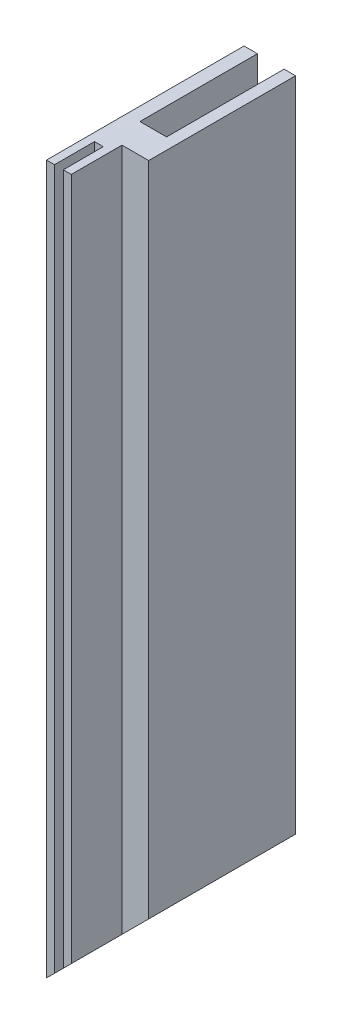
ISO-10303-21;
HEADER;
FILE_DESCRIPTION(('STEP AP214'),'2;1');
FILE_NAME('part.step','',(''),(''),'','','');
FILE_SCHEMA(('AUTOMOTIVE_DESIGN { 1 0 10303 214 1 1 1 1 }'));
ENDSEC;
DATA;
#1=APPLICATION_CONTEXT('core data for automotive mechanical design processes');
#2=APPLICATION_PROTOCOL_DEFINITION('international standard','automotive_design',2000,#1);
#3=PRODUCT_CONTEXT('',#1,'mechanical');
#4=PRODUCT('Part','Part','',(#3));
#5=PRODUCT_RELATED_PRODUCT_CATEGORY('part','',(#4));
#6=PRODUCT_DEFINITION_FORMATION('','',#4);
#7=PRODUCT_DEFINITION_CONTEXT('part definition',#1,'design');
#8=PRODUCT_DEFINITION('design','',#6,#7);
#9=PRODUCT_DEFINITION_SHAPE('','',#8);
#10=(LENGTH_UNIT() NAMED_UNIT(*) SI_UNIT(.MILLI.,.METRE.));
#11=(NAMED_UNIT(*) PLANE_ANGLE_UNIT() SI_UNIT($,.RADIAN.));
#12=(NAMED_UNIT(*) SI_UNIT($,.STERADIAN.) SOLID_ANGLE_UNIT());
#13=UNCERTAINTY_MEASURE_WITH_UNIT(LENGTH_MEASURE(1.E-05),#10,'distance_accuracy_value','');
#14=(GEOMETRIC_REPRESENTATION_CONTEXT(3) GLOBAL_UNCERTAINTY_ASSIGNED_CONTEXT((#13)) GLOBAL_UNIT_ASSIGNED_CONTEXT((#10,
#11,#12)) REPRESENTATION_CONTEXT('',''));
#15=CARTESIAN_POINT('',(0.,0.,0.));
#16=DIRECTION('',(0.,0.,1.));
#17=DIRECTION('',(1.,0.,0.));
#18=AXIS2_PLACEMENT_3D('',#15,#16,#17);
#19=CARTESIAN_POINT('',(-51.5057953741814,265.3,37.));
#20=DIRECTION('',(1.,0.,0.));
#21=DIRECTION('',(0.,0.,-1.));
#22=AXIS2_PLACEMENT_3D('',#19,#20,#21);
#23=PLANE('',#22);
#24=DIRECTION('',(0.,0.,1.));
#25=VECTOR('',#24,1.);
#26=CARTESIAN_POINT('',(-51.5057953741814,0.,37.));
#27=LINE('',#26,#25);
#28=CARTESIAN_POINT('',(-51.5057953741814,0.,-37.));
#29=VERTEX_POINT('',#28);
#30=CARTESIAN_POINT('',(-51.5057953741814,0.,37.));
#31=VERTEX_POINT('',#30);
#32=EDGE_CURVE('E275',#29,#31,#27,.T.);
#33=ORIENTED_EDGE('',*,*,#32,.T.);
#34=DIRECTION('',(0.,-1.,0.));
#35=VECTOR('',#34,1.);
#36=CARTESIAN_POINT('',(-51.5057953741814,265.3,37.));
#37=LINE('',#36,#35);
#38=CARTESIAN_POINT('',(-51.5057953741814,265.3,37.));
#39=VERTEX_POINT('',#38);
#40=EDGE_CURVE('E11',#39,#31,#37,.T.);
#41=ORIENTED_EDGE('',*,*,#40,.F.);
#42=DIRECTION('',(0.,0.,1.));
#43=VECTOR('',#42,1.);
#44=CARTESIAN_POINT('',(-51.5057953741814,265.3,37.));
#45=LINE('',#44,#43);
#46=CARTESIAN_POINT('',(-51.5057953741814,265.3,-37.));
#47=VERTEX_POINT('',#46);
#48=EDGE_CURVE('E285',#47,#39,#45,.T.);
#49=ORIENTED_EDGE('',*,*,#48,.F.);
#50=DIRECTION('',(0.,-1.,0.));
#51=VECTOR('',#50,1.);
#52=CARTESIAN_POINT('',(-51.5057953741814,265.3,-37.));
#53=LINE('',#52,#51);
#54=EDGE_CURVE('E318',#47,#29,#53,.T.);
#55=ORIENTED_EDGE('',*,*,#54,.T.);
#56=EDGE_LOOP('',(#33,#41,#49,#55));
#57=FACE_BOUND('',#56,.T.);
#58=ADVANCED_FACE('F42',(#57),#23,.F.);
#59=CARTESIAN_POINT('',(-48.5057953741814,265.3,37.));
#60=DIRECTION('',(0.,0.,-1.));
#61=DIRECTION('',(-1.,0.,0.));
#62=AXIS2_PLACEMENT_3D('',#59,#60,#61);
#63=PLANE('',#62);
#64=ORIENTED_EDGE('',*,*,#40,.T.);
#65=DIRECTION('',(0.707106781186546,0.707106781186549,0.));
#66=VECTOR('',#65,1.);
#67=CARTESIAN_POINT('',(82.6442046258186,134.15,37.));
#68=LINE('',#67,#66);
#69=CARTESIAN_POINT('',(-48.5057953741814,3.,37.));
#70=VERTEX_POINT('',#69);
#71=EDGE_CURVE('E242',#31,#70,#68,.T.);
#72=ORIENTED_EDGE('',*,*,#71,.T.);
#73=DIRECTION('',(0.,-1.,0.));
#74=VECTOR('',#73,1.);
#75=CARTESIAN_POINT('',(-48.5057953741814,265.3,37.));
#76=LINE('',#75,#74);
#77=CARTESIAN_POINT('',(-48.5057953741814,265.3,37.));
#78=VERTEX_POINT('',#77);
#79=EDGE_CURVE('E50',#78,#70,#76,.T.);
#80=ORIENTED_EDGE('',*,*,#79,.F.);
#81=DIRECTION('',(1.,0.,0.));
#82=VECTOR('',#81,1.);
#83=CARTESIAN_POINT('',(-48.5057953741814,265.3,37.));
#84=LINE('',#83,#82);
#85=EDGE_CURVE('E289',#39,#78,#84,.T.);
#86=ORIENTED_EDGE('',*,*,#85,.F.);
#87=EDGE_LOOP('',(#64,#72,#80,#86));
#88=FACE_BOUND('',#87,.T.);
#89=ADVANCED_FACE('F360',(#88),#63,.F.);
#90=CARTESIAN_POINT('',(-48.5057953741814,265.3,22.));
#91=DIRECTION('',(-1.,0.,0.));
#92=DIRECTION('',(0.,0.,1.));
#93=AXIS2_PLACEMENT_3D('',#90,#91,#92);
#94=PLANE('',#93);
#95=ORIENTED_EDGE('',*,*,#79,.T.);
#96=DIRECTION('',(0.,0.,-1.));
#97=VECTOR('',#96,1.);
#98=CARTESIAN_POINT('',(-48.5057953741814,3.,22.));
#99=LINE('',#98,#97);
#100=CARTESIAN_POINT('',(-48.5057953741814,2.99999999999995,22.));
#101=VERTEX_POINT('',#100);
#102=EDGE_CURVE('E238',#70,#101,#99,.T.);
#103=ORIENTED_EDGE('',*,*,#102,.T.);
#104=DIRECTION('',(0.,-1.,0.));
#105=VECTOR('',#104,1.);
#106=CARTESIAN_POINT('',(-48.5057953741814,265.3,22.));
#107=LINE('',#106,#105);
#108=CARTESIAN_POINT('',(-48.5057953741814,265.3,22.));
#109=VERTEX_POINT('',#108);
#110=EDGE_CURVE('E349',#109,#101,#107,.T.);
#111=ORIENTED_EDGE('',*,*,#110,.F.);
#112=DIRECTION('',(0.,0.,-1.));
#113=VECTOR('',#112,1.);
#114=CARTESIAN_POINT('',(-48.5057953741814,265.3,22.));
#115=LINE('',#114,#113);
#116=EDGE_CURVE('E292',#78,#109,#115,.T.);
#117=ORIENTED_EDGE('',*,*,#116,.F.);
#118=EDGE_LOOP('',(#95,#103,#111,#117));
#119=FACE_BOUND('',#118,.T.);
#120=ADVANCED_FACE('F357',(#119),#94,.F.);
#121=CARTESIAN_POINT('',(-45.2057953741814,265.3,22.));
#122=DIRECTION('',(0.,0.,-1.));
#123=DIRECTION('',(-1.,0.,0.));
#124=AXIS2_PLACEMENT_3D('',#121,#122,#123);
#125=PLANE('',#124);
#126=ORIENTED_EDGE('',*,*,#110,.T.);
#127=DIRECTION('',(0.707106781186546,0.707106781186549,0.));
#128=VECTOR('',#127,1.);
#129=CARTESIAN_POINT('',(84.2942046258186,135.8,22.));
#130=LINE('',#129,#128);
#131=CARTESIAN_POINT('',(-45.2057953741814,6.30000000000003,22.));
#132=VERTEX_POINT('',#131);
#133=EDGE_CURVE('E234',#101,#132,#130,.T.);
#134=ORIENTED_EDGE('',*,*,#133,.T.);
#135=DIRECTION('',(0.,-1.,0.));
#136=VECTOR('',#135,1.);
#137=CARTESIAN_POINT('',(-45.2057953741814,265.3,22.));
#138=LINE('',#137,#136);
#139=CARTESIAN_POINT('',(-45.2057953741814,265.3,22.));
#140=VERTEX_POINT('',#139);
#141=EDGE_CURVE('E345',#140,#132,#138,.T.);
#142=ORIENTED_EDGE('',*,*,#141,.F.);
#143=DIRECTION('',(1.,0.,0.));
#144=VECTOR('',#143,1.);
#145=CARTESIAN_POINT('',(-45.2057953741814,265.3,22.));
#146=LINE('',#145,#144);
#147=EDGE_CURVE('E295',#109,#140,#146,.T.);
#148=ORIENTED_EDGE('',*,*,#147,.F.);
#149=EDGE_LOOP('',(#126,#134,#142,#148));
#150=FACE_BOUND('',#149,.T.);
#151=ADVANCED_FACE('F364',(#150),#125,.F.);
#152=CARTESIAN_POINT('',(-45.2057953741814,265.3,37.));
#153=DIRECTION('',(1.,0.,0.));
#154=DIRECTION('',(0.,0.,-1.));
#155=AXIS2_PLACEMENT_3D('',#152,#153,#154);
#156=PLANE('',#155);
#157=ORIENTED_EDGE('',*,*,#141,.T.);
#158=DIRECTION('',(0.,0.,1.));
#159=VECTOR('',#158,1.);
#160=CARTESIAN_POINT('',(-45.2057953741814,6.30000000000003,37.));
#161=LINE('',#160,#159);
#162=CARTESIAN_POINT('',(-45.2057953741814,6.30000000000003,37.));
#163=VERTEX_POINT('',#162);
#164=EDGE_CURVE('E230',#132,#163,#161,.T.);
#165=ORIENTED_EDGE('',*,*,#164,.T.);
#166=DIRECTION('',(0.,-1.,0.));
#167=VECTOR('',#166,1.);
#168=CARTESIAN_POINT('',(-45.2057953741814,265.3,37.));
#169=LINE('',#168,#167);
#170=CARTESIAN_POINT('',(-45.2057953741814,265.3,37.));
#171=VERTEX_POINT('',#170);
#172=EDGE_CURVE('E341',#171,#163,#169,.T.);
#173=ORIENTED_EDGE('',*,*,#172,.F.);
#174=DIRECTION('',(0.,0.,1.));
#175=VECTOR('',#174,1.);
#176=CARTESIAN_POINT('',(-45.2057953741814,265.3,37.));
#177=LINE('',#176,#175);
#178=EDGE_CURVE('E298',#140,#171,#177,.T.);
#179=ORIENTED_EDGE('',*,*,#178,.F.);
#180=EDGE_LOOP('',(#157,#165,#173,#179));
#181=FACE_BOUND('',#180,.T.);
#182=ADVANCED_FACE('F368',(#181),#156,.F.);
#183=CARTESIAN_POINT('',(-42.2057953741814,265.3,37.));
#184=DIRECTION('',(0.,0.,-1.));
#185=DIRECTION('',(-1.,0.,0.));
#186=AXIS2_PLACEMENT_3D('',#183,#184,#185);
#187=PLANE('',#186);
#188=ORIENTED_EDGE('',*,*,#172,.T.);
#189=DIRECTION('',(0.707106781186546,0.707106781186549,0.));
#190=VECTOR('',#189,1.);
#191=CARTESIAN_POINT('',(85.7942046258186,137.3,37.));
#192=LINE('',#191,#190);
#193=CARTESIAN_POINT('',(-42.2057953741814,9.30000000000003,37.));
#194=VERTEX_POINT('',#193);
#195=EDGE_CURVE('E226',#163,#194,#192,.T.);
#196=ORIENTED_EDGE('',*,*,#195,.T.);
#197=DIRECTION('',(0.,-1.,0.));
#198=VECTOR('',#197,1.);
#199=CARTESIAN_POINT('',(-42.2057953741814,265.3,37.));
#200=LINE('',#199,#198);
#201=CARTESIAN_POINT('',(-42.2057953741814,265.3,37.));
#202=VERTEX_POINT('',#201);
#203=EDGE_CURVE('E337',#202,#194,#200,.T.);
#204=ORIENTED_EDGE('',*,*,#203,.F.);
#205=DIRECTION('',(1.,0.,0.));
#206=VECTOR('',#205,1.);
#207=CARTESIAN_POINT('',(-42.2057953741814,265.3,37.));
#208=LINE('',#207,#206);
#209=EDGE_CURVE('E301',#171,#202,#208,.T.);
#210=ORIENTED_EDGE('',*,*,#209,.F.);
#211=EDGE_LOOP('',(#188,#196,#204,#210));
#212=FACE_BOUND('',#211,.T.);
#213=ADVANCED_FACE('F396',(#212),#187,.F.);
#214=CARTESIAN_POINT('',(-42.2057953741814,265.3,18.));
#215=DIRECTION('',(-1.,0.,0.));
#216=DIRECTION('',(0.,0.,1.));
#217=AXIS2_PLACEMENT_3D('',#214,#215,#216);
#218=PLANE('',#217);
#219=ORIENTED_EDGE('',*,*,#203,.T.);
#220=DIRECTION('',(0.,0.,-1.));
#221=VECTOR('',#220,1.);
#222=CARTESIAN_POINT('',(-42.2057953741814,9.30000000000003,18.));
#223=LINE('',#222,#221);
#224=CARTESIAN_POINT('',(-42.2057953741814,9.29999999999998,18.));
#225=VERTEX_POINT('',#224);
#226=EDGE_CURVE('E222',#194,#225,#223,.T.);
#227=ORIENTED_EDGE('',*,*,#226,.T.);
#228=DIRECTION('',(0.,-1.,0.));
#229=VECTOR('',#228,1.);
#230=CARTESIAN_POINT('',(-42.2057953741814,265.3,18.));
#231=LINE('',#230,#229);
#232=CARTESIAN_POINT('',(-42.2057953741814,265.3,18.));
#233=VERTEX_POINT('',#232);
#234=EDGE_CURVE('E333',#233,#225,#231,.T.);
#235=ORIENTED_EDGE('',*,*,#234,.F.);
#236=DIRECTION('',(0.,0.,-1.));
#237=VECTOR('',#236,1.);
#238=CARTESIAN_POINT('',(-42.2057953741814,265.3,18.));
#239=LINE('',#238,#237);
#240=EDGE_CURVE('E304',#202,#233,#239,.T.);
#241=ORIENTED_EDGE('',*,*,#240,.F.);
#242=EDGE_LOOP('',(#219,#227,#235,#241));
#243=FACE_BOUND('',#242,.T.);
#244=ADVANCED_FACE('F393',(#243),#218,.F.);
#245=CARTESIAN_POINT('',(-32.2057953741814,265.3,18.));
#246=DIRECTION('',(0.,0.,-1.));
#247=DIRECTION('',(-1.,0.,0.));
#248=AXIS2_PLACEMENT_3D('',#245,#246,#247);
#249=PLANE('',#248);
#250=ORIENTED_EDGE('',*,*,#234,.T.);
#251=DIRECTION('',(0.707106781186546,0.707106781186549,0.));
#252=VECTOR('',#251,1.);
#253=CARTESIAN_POINT('',(90.7942046258186,142.3,18.));
#254=LINE('',#253,#252);
#255=CARTESIAN_POINT('',(-32.2057953741814,19.3000000000001,18.));
#256=VERTEX_POINT('',#255);
#257=EDGE_CURVE('E218',#225,#256,#254,.T.);
#258=ORIENTED_EDGE('',*,*,#257,.T.);
#259=DIRECTION('',(0.,-1.,0.));
#260=VECTOR('',#259,1.);
#261=CARTESIAN_POINT('',(-32.2057953741814,265.3,18.));
#262=LINE('',#261,#260);
#263=CARTESIAN_POINT('',(-32.2057953741814,265.3,18.));
#264=VERTEX_POINT('',#263);
#265=EDGE_CURVE('E329',#264,#256,#262,.T.);
#266=ORIENTED_EDGE('',*,*,#265,.F.);
#267=DIRECTION('',(1.,0.,0.));
#268=VECTOR('',#267,1.);
#269=CARTESIAN_POINT('',(-32.2057953741814,265.3,18.));
#270=LINE('',#269,#268);
#271=EDGE_CURVE('E307',#233,#264,#270,.T.);
#272=ORIENTED_EDGE('',*,*,#271,.F.);
#273=EDGE_LOOP('',(#250,#258,#266,#272));
#274=FACE_BOUND('',#273,.T.);
#275=ADVANCED_FACE('F390',(#274),#249,.F.);
#276=CARTESIAN_POINT('',(-32.2057953741814,265.3,-37.));
#277=DIRECTION('',(-1.,0.,0.));
#278=DIRECTION('',(0.,0.,1.));
#279=AXIS2_PLACEMENT_3D('',#276,#277,#278);
#280=PLANE('',#279);
#281=ORIENTED_EDGE('',*,*,#265,.T.);
#282=DIRECTION('',(0.,0.,-1.));
#283=VECTOR('',#282,1.);
#284=CARTESIAN_POINT('',(-32.2057953741814,19.3000000000001,-37.));
#285=LINE('',#284,#283);
#286=CARTESIAN_POINT('',(-32.2057953741814,19.3,-37.));
#287=VERTEX_POINT('',#286);
#288=EDGE_CURVE('E214',#256,#287,#285,.T.);
#289=ORIENTED_EDGE('',*,*,#288,.T.);
#290=DIRECTION('',(0.,-1.,0.));
#291=VECTOR('',#290,1.);
#292=CARTESIAN_POINT('',(-32.2057953741814,265.3,-37.));
#293=LINE('',#292,#291);
#294=CARTESIAN_POINT('',(-32.2057953741814,265.3,-37.));
#295=VERTEX_POINT('',#294);
#296=EDGE_CURVE('E325',#295,#287,#293,.T.);
#297=ORIENTED_EDGE('',*,*,#296,.F.);
#298=DIRECTION('',(0.,0.,-1.));
#299=VECTOR('',#298,1.);
#300=CARTESIAN_POINT('',(-32.2057953741814,265.3,-37.));
#301=LINE('',#300,#299);
#302=EDGE_CURVE('E310',#264,#295,#301,.T.);
#303=ORIENTED_EDGE('',*,*,#302,.F.);
#304=EDGE_LOOP('',(#281,#289,#297,#303));
#305=FACE_BOUND('',#304,.T.);
#306=ADVANCED_FACE('F385',(#305),#280,.F.);
#307=CARTESIAN_POINT('',(-51.5057953741814,265.3,-37.));
#308=DIRECTION('',(0.,0.,1.));
#309=DIRECTION('',(1.,0.,0.));
#310=AXIS2_PLACEMENT_3D('',#307,#308,#309);
#311=PLANE('',#310);
#312=ORIENTED_EDGE('',*,*,#296,.T.);
#313=DIRECTION('',(-0.707106781186546,-0.707106781186549,0.));
#314=VECTOR('',#313,1.);
#315=CARTESIAN_POINT('',(81.1442046258186,132.65,-37.));
#316=LINE('',#315,#314);
#317=EDGE_CURVE('E209',#287,#29,#316,.T.);
#318=ORIENTED_EDGE('',*,*,#317,.T.);
#319=ORIENTED_EDGE('',*,*,#54,.F.);
#320=DIRECTION('',(-1.,0.,0.));
#321=VECTOR('',#320,1.);
#322=CARTESIAN_POINT('',(-51.5057953741814,265.3,-37.));
#323=LINE('',#322,#321);
#324=CARTESIAN_POINT('',(-46.5057953741814,265.3,-37.));
#325=VERTEX_POINT('',#324);
#326=EDGE_CURVE('E313',#325,#47,#323,.T.);
#327=ORIENTED_EDGE('',*,*,#326,.F.);
#328=DIRECTION('',(0.,1.,0.));
#329=VECTOR('',#328,1.);
#330=CARTESIAN_POINT('',(-46.5057953741814,255.3,-37.));
#331=LINE('',#330,#329);
#332=CARTESIAN_POINT('',(-46.5057953741814,255.3,-37.));
#333=VERTEX_POINT('',#332);
#334=EDGE_CURVE('E272',#333,#325,#331,.T.);
#335=ORIENTED_EDGE('',*,*,#334,.F.);
#336=DIRECTION('',(-1.,0.,0.));
#337=VECTOR('',#336,1.);
#338=CARTESIAN_POINT('',(-46.5057953741814,255.3,-37.));
#339=LINE('',#338,#337);
#340=CARTESIAN_POINT('',(-36.5057953741814,255.3,-37.));
#341=VERTEX_POINT('',#340);
#342=EDGE_CURVE('E259',#341,#333,#339,.T.);
#343=ORIENTED_EDGE('',*,*,#342,.F.);
#344=DIRECTION('',(0.,1.,0.));
#345=VECTOR('',#344,1.);
#346=CARTESIAN_POINT('',(-36.5057953741814,255.3,-37.));
#347=LINE('',#346,#345);
#348=CARTESIAN_POINT('',(-36.5057953741814,265.3,-37.));
#349=VERTEX_POINT('',#348);
#350=EDGE_CURVE('E276',#341,#349,#347,.T.);
#351=ORIENTED_EDGE('',*,*,#350,.T.);
#352=EDGE_CURVE('E314',#295,#349,#323,.T.);
#353=ORIENTED_EDGE('',*,*,#352,.F.);
#354=EDGE_LOOP('',(#312,#318,#319,#327,#335,#343,#351,#353));
#355=FACE_BOUND('',#354,.T.);
#356=ADVANCED_FACE('F380',(#355),#311,.F.);
#357=CARTESIAN_POINT('',(0.,265.3,0.));
#358=DIRECTION('',(0.,-1.,0.));
#359=DIRECTION('',(0.,0.,-1.));
#360=AXIS2_PLACEMENT_3D('',#357,#358,#359);
#361=PLANE('',#360);
#362=DIRECTION('',(1.,0.,0.));
#363=VECTOR('',#362,1.);
#364=CARTESIAN_POINT('',(-36.5057953741814,265.3,7.));
#365=LINE('',#364,#363);
#366=CARTESIAN_POINT('',(-46.5057953741814,265.3,7.));
#367=VERTEX_POINT('',#366);
#368=CARTESIAN_POINT('',(-36.5057953741814,265.3,7.));
#369=VERTEX_POINT('',#368);
#370=EDGE_CURVE('E266',#367,#369,#365,.T.);
#371=ORIENTED_EDGE('',*,*,#370,.F.);
#372=DIRECTION('',(0.,0.,1.));
#373=VECTOR('',#372,1.);
#374=CARTESIAN_POINT('',(-46.5057953741814,265.3,7.));
#375=LINE('',#374,#373);
#376=EDGE_CURVE('E65',#325,#367,#375,.T.);
#377=ORIENTED_EDGE('',*,*,#376,.F.);
#378=ORIENTED_EDGE('',*,*,#326,.T.);
#379=ORIENTED_EDGE('',*,*,#48,.T.);
#380=ORIENTED_EDGE('',*,*,#85,.T.);
#381=ORIENTED_EDGE('',*,*,#116,.T.);
#382=ORIENTED_EDGE('',*,*,#147,.T.);
#383=ORIENTED_EDGE('',*,*,#178,.T.);
#384=ORIENTED_EDGE('',*,*,#209,.T.);
#385=ORIENTED_EDGE('',*,*,#240,.T.);
#386=ORIENTED_EDGE('',*,*,#271,.T.);
#387=ORIENTED_EDGE('',*,*,#302,.T.);
#388=ORIENTED_EDGE('',*,*,#352,.T.);
#389=DIRECTION('',(0.,0.,-1.));
#390=VECTOR('',#389,1.);
#391=CARTESIAN_POINT('',(-36.5057953741814,265.3,-37.));
#392=LINE('',#391,#390);
#393=EDGE_CURVE('E251',#369,#349,#392,.T.);
#394=ORIENTED_EDGE('',*,*,#393,.F.);
#395=EDGE_LOOP('',(#371,#377,#378,#379,#380,#381,#382,#383,#384,#385,#386,#387,#388,#394));
#396=FACE_BOUND('',#395,.T.);
#397=ADVANCED_FACE('F373',(#396),#361,.F.);
#398=CARTESIAN_POINT('',(-46.5057953741814,255.3,7.));
#399=DIRECTION('',(-1.,0.,0.));
#400=DIRECTION('',(0.,0.,1.));
#401=AXIS2_PLACEMENT_3D('',#398,#399,#400);
#402=PLANE('',#401);
#403=ORIENTED_EDGE('',*,*,#376,.T.);
#404=DIRECTION('',(0.,1.,0.));
#405=VECTOR('',#404,1.);
#406=CARTESIAN_POINT('',(-46.5057953741814,255.3,7.));
#407=LINE('',#406,#405);
#408=CARTESIAN_POINT('',(-46.5057953741814,255.3,7.));
#409=VERTEX_POINT('',#408);
#410=EDGE_CURVE('E263',#409,#367,#407,.T.);
#411=ORIENTED_EDGE('',*,*,#410,.F.);
#412=DIRECTION('',(0.,0.,1.));
#413=VECTOR('',#412,1.);
#414=CARTESIAN_POINT('',(-46.5057953741814,255.3,7.));
#415=LINE('',#414,#413);
#416=EDGE_CURVE('E246',#333,#409,#415,.T.);
#417=ORIENTED_EDGE('',*,*,#416,.F.);
#418=ORIENTED_EDGE('',*,*,#334,.T.);
#419=EDGE_LOOP('',(#403,#411,#417,#418));
#420=FACE_BOUND('',#419,.T.);
#421=ADVANCED_FACE('F563',(#420),#402,.F.);
#422=CARTESIAN_POINT('',(-36.5057953741814,255.3,-37.));
#423=DIRECTION('',(1.,0.,0.));
#424=DIRECTION('',(0.,0.,-1.));
#425=AXIS2_PLACEMENT_3D('',#422,#423,#424);
#426=PLANE('',#425);
#427=ORIENTED_EDGE('',*,*,#393,.T.);
#428=ORIENTED_EDGE('',*,*,#350,.F.);
#429=DIRECTION('',(0.,0.,-1.));
#430=VECTOR('',#429,1.);
#431=CARTESIAN_POINT('',(-36.5057953741814,255.3,-37.));
#432=LINE('',#431,#430);
#433=CARTESIAN_POINT('',(-36.5057953741814,255.3,7.));
#434=VERTEX_POINT('',#433);
#435=EDGE_CURVE('E255',#434,#341,#432,.T.);
#436=ORIENTED_EDGE('',*,*,#435,.F.);
#437=DIRECTION('',(0.,1.,0.));
#438=VECTOR('',#437,1.);
#439=CARTESIAN_POINT('',(-36.5057953741814,255.3,7.));
#440=LINE('',#439,#438);
#441=EDGE_CURVE('E280',#434,#369,#440,.T.);
#442=ORIENTED_EDGE('',*,*,#441,.T.);
#443=EDGE_LOOP('',(#427,#428,#436,#442));
#444=FACE_BOUND('',#443,.T.);
#445=ADVANCED_FACE('F553',(#444),#426,.F.);
#446=CARTESIAN_POINT('',(-36.5057953741814,255.3,7.));
#447=DIRECTION('',(0.,0.,1.));
#448=DIRECTION('',(1.,0.,0.));
#449=AXIS2_PLACEMENT_3D('',#446,#447,#448);
#450=PLANE('',#449);
#451=ORIENTED_EDGE('',*,*,#370,.T.);
#452=ORIENTED_EDGE('',*,*,#441,.F.);
#453=DIRECTION('',(1.,0.,0.));
#454=VECTOR('',#453,1.);
#455=CARTESIAN_POINT('',(-36.5057953741814,255.3,7.));
#456=LINE('',#455,#454);
#457=EDGE_CURVE('E250',#409,#434,#456,.T.);
#458=ORIENTED_EDGE('',*,*,#457,.F.);
#459=ORIENTED_EDGE('',*,*,#410,.T.);
#460=EDGE_LOOP('',(#451,#452,#458,#459));
#461=FACE_BOUND('',#460,.T.);
#462=ADVANCED_FACE('F543',(#461),#450,.F.);
#463=CARTESIAN_POINT('',(0.,255.3,0.));
#464=DIRECTION('',(0.,-1.,0.));
#465=DIRECTION('',(0.,0.,-1.));
#466=AXIS2_PLACEMENT_3D('',#463,#464,#465);
#467=PLANE('',#466);
#468=ORIENTED_EDGE('',*,*,#416,.T.);
#469=ORIENTED_EDGE('',*,*,#457,.T.);
#470=ORIENTED_EDGE('',*,*,#435,.T.);
#471=ORIENTED_EDGE('',*,*,#342,.T.);
#472=EDGE_LOOP('',(#468,#469,#470,#471));
#473=FACE_BOUND('',#472,.T.);
#474=ADVANCED_FACE('F475',(#473),#467,.F.);
#475=CARTESIAN_POINT('',(-25.7528976870908,25.7528976870907,0.));
#476=DIRECTION('',(-0.707106781186549,0.707106781186546,0.));
#477=DIRECTION('',(-0.707106781186546,-0.707106781186549,0.));
#478=AXIS2_PLACEMENT_3D('',#475,#476,#477);
#479=PLANE('',#478);
#480=DIRECTION('',(0.,0.,1.));
#481=VECTOR('',#480,1.);
#482=CARTESIAN_POINT('',(-36.3070147050634,15.1987806691181,-25.2));
#483=LINE('',#482,#481);
#484=CARTESIAN_POINT('',(-36.3070147050634,15.1987806691181,-25.2));
#485=VERTEX_POINT('',#484);
#486=CARTESIAN_POINT('',(-36.3070147050634,15.1987806691181,3.19999999999999));
#487=VERTEX_POINT('',#486);
#488=EDGE_CURVE('E184',#485,#487,#483,.T.);
#489=ORIENTED_EDGE('',*,*,#488,.F.);
#490=DIRECTION('',(0.707106781186547,0.707106781186548,0.));
#491=VECTOR('',#490,1.);
#492=CARTESIAN_POINT('',(-41.5396048858438,9.96619048833764,-25.2));
#493=LINE('',#492,#491);
#494=CARTESIAN_POINT('',(-41.5396048858438,9.96619048833764,-25.2));
#495=VERTEX_POINT('',#494);
#496=EDGE_CURVE('E57',#495,#485,#493,.T.);
#497=ORIENTED_EDGE('',*,*,#496,.F.);
#498=DIRECTION('',(0.,0.,-1.));
#499=VECTOR('',#498,1.);
#500=CARTESIAN_POINT('',(-41.5396048858438,9.96619048833764,-25.2));
#501=LINE('',#500,#499);
#502=CARTESIAN_POINT('',(-41.5396048858438,9.96619048833764,3.19999999999999));
#503=VERTEX_POINT('',#502);
#504=EDGE_CURVE('E192',#503,#495,#501,.T.);
#505=ORIENTED_EDGE('',*,*,#504,.F.);
#506=DIRECTION('',(-0.707106781186547,-0.707106781186548,0.));
#507=VECTOR('',#506,1.);
#508=CARTESIAN_POINT('',(-41.5396048858438,9.96619048833764,3.19999999999999));
#509=LINE('',#508,#507);
#510=EDGE_CURVE('E173',#487,#503,#509,.T.);
#511=ORIENTED_EDGE('',*,*,#510,.F.);
#512=EDGE_LOOP('',(#489,#497,#505,#511));
#513=FACE_BOUND('',#512,.T.);
#514=ORIENTED_EDGE('',*,*,#32,.F.);
#515=ORIENTED_EDGE('',*,*,#317,.F.);
#516=ORIENTED_EDGE('',*,*,#288,.F.);
#517=ORIENTED_EDGE('',*,*,#257,.F.);
#518=ORIENTED_EDGE('',*,*,#226,.F.);
#519=ORIENTED_EDGE('',*,*,#195,.F.);
#520=ORIENTED_EDGE('',*,*,#164,.F.);
#521=ORIENTED_EDGE('',*,*,#133,.F.);
#522=ORIENTED_EDGE('',*,*,#102,.F.);
#523=ORIENTED_EDGE('',*,*,#71,.F.);
#524=EDGE_LOOP('',(#514,#515,#516,#517,#518,#519,#520,#521,#522,#523));
#525=FACE_BOUND('',#524,.T.);
#526=ADVANCED_FACE('F189',(#513,#525),#479,.F.);
#527=CARTESIAN_POINT('',(-67.9488083999376,36.3753940024313,-25.2));
#528=DIRECTION('',(0.,0.,-1.));
#529=DIRECTION('',(-1.,0.,0.));
#530=AXIS2_PLACEMENT_3D('',#527,#528,#529);
#531=PLANE('',#530);
#532=DIRECTION('',(-0.707106781186546,-0.707106781186549,0.));
#533=VECTOR('',#532,1.);
#534=CARTESIAN_POINT('',(-47.1964591353362,15.62304473783,-25.2));
#535=LINE('',#534,#533);
#536=CARTESIAN_POINT('',(-41.9638689545558,20.8556349186105,-25.2));
#537=VERTEX_POINT('',#536);
#538=CARTESIAN_POINT('',(-47.1964591353362,15.62304473783,-25.2));
#539=VERTEX_POINT('',#538);
#540=EDGE_CURVE('E210',#537,#539,#535,.T.);
#541=ORIENTED_EDGE('',*,*,#540,.T.);
#542=DIRECTION('',(0.707106781186549,-0.707106781186546,0.));
#543=VECTOR('',#542,1.);
#544=CARTESIAN_POINT('',(-67.9488083999376,36.3753940024313,-25.2));
#545=LINE('',#544,#543);
#546=EDGE_CURVE('E199',#539,#495,#545,.T.);
#547=ORIENTED_EDGE('',*,*,#546,.T.);
#548=ORIENTED_EDGE('',*,*,#496,.T.);
#549=DIRECTION('',(0.707106781186549,-0.707106781186546,0.));
#550=VECTOR('',#549,1.);
#551=CARTESIAN_POINT('',(-62.7162182191572,41.6079841832118,-25.2));
#552=LINE('',#551,#550);
#553=EDGE_CURVE('E181',#537,#485,#552,.T.);
#554=ORIENTED_EDGE('',*,*,#553,.F.);
#555=EDGE_LOOP('',(#541,#547,#548,#554));
#556=FACE_BOUND('',#555,.T.);
#557=ADVANCED_FACE('F474',(#556),#531,.F.);
#558=CARTESIAN_POINT('',(-67.9488083999376,36.3753940024313,-25.2));
#559=DIRECTION('',(-0.707106781186546,-0.707106781186549,0.));
#560=DIRECTION('',(0.707106781186549,-0.707106781186546,0.));
#561=AXIS2_PLACEMENT_3D('',#558,#559,#560);
#562=PLANE('',#561);
#563=DIRECTION('',(0.,0.,1.));
#564=VECTOR('',#563,1.);
#565=CARTESIAN_POINT('',(-47.1964591353362,15.62304473783,-25.2));
#566=LINE('',#565,#564);
#567=CARTESIAN_POINT('',(-47.1964591353362,15.62304473783,3.19999999999999));
#568=VERTEX_POINT('',#567);
#569=EDGE_CURVE('E626',#539,#568,#566,.T.);
#570=ORIENTED_EDGE('',*,*,#569,.T.);
#571=DIRECTION('',(0.707106781186549,-0.707106781186546,0.));
#572=VECTOR('',#571,1.);
#573=CARTESIAN_POINT('',(-67.9488083999376,36.3753940024313,3.19999999999999));
#574=LINE('',#573,#572);
#575=EDGE_CURVE('E180',#568,#503,#574,.T.);
#576=ORIENTED_EDGE('',*,*,#575,.T.);
#577=ORIENTED_EDGE('',*,*,#504,.T.);
#578=ORIENTED_EDGE('',*,*,#546,.F.);
#579=EDGE_LOOP('',(#570,#576,#577,#578));
#580=FACE_BOUND('',#579,.T.);
#581=ADVANCED_FACE('F488',(#580),#562,.F.);
#582=CARTESIAN_POINT('',(-67.9488083999376,36.3753940024313,3.19999999999999));
#583=DIRECTION('',(0.,0.,1.));
#584=DIRECTION('',(1.,0.,0.));
#585=AXIS2_PLACEMENT_3D('',#582,#583,#584);
#586=PLANE('',#585);
#587=DIRECTION('',(0.707106781186546,0.707106781186549,0.));
#588=VECTOR('',#587,1.);
#589=CARTESIAN_POINT('',(-47.1964591353362,15.62304473783,3.19999999999999));
#590=LINE('',#589,#588);
#591=CARTESIAN_POINT('',(-41.9638689545558,20.8556349186105,3.19999999999999));
#592=VERTEX_POINT('',#591);
#593=EDGE_CURVE('E176',#568,#592,#590,.T.);
#594=ORIENTED_EDGE('',*,*,#593,.T.);
#595=DIRECTION('',(0.707106781186549,-0.707106781186546,0.));
#596=VECTOR('',#595,1.);
#597=CARTESIAN_POINT('',(-62.7162182191572,41.6079841832118,3.19999999999999));
#598=LINE('',#597,#596);
#599=EDGE_CURVE('E168',#592,#487,#598,.T.);
#600=ORIENTED_EDGE('',*,*,#599,.T.);
#601=ORIENTED_EDGE('',*,*,#510,.T.);
#602=ORIENTED_EDGE('',*,*,#575,.F.);
#603=EDGE_LOOP('',(#594,#600,#601,#602));
#604=FACE_BOUND('',#603,.T.);
#605=ADVANCED_FACE('F170',(#604),#586,.F.);
#606=CARTESIAN_POINT('',(-62.7162182191572,41.6079841832118,-25.2));
#607=DIRECTION('',(0.707106781186546,0.707106781186549,0.));
#608=DIRECTION('',(-0.707106781186549,0.707106781186546,0.));
#609=AXIS2_PLACEMENT_3D('',#606,#607,#608);
#610=PLANE('',#609);
#611=DIRECTION('',(0.,0.,-1.));
#612=VECTOR('',#611,1.);
#613=CARTESIAN_POINT('',(-41.9638689545558,20.8556349186105,-25.2));
#614=LINE('',#613,#612);
#615=EDGE_CURVE('E206',#592,#537,#614,.T.);
#616=ORIENTED_EDGE('',*,*,#615,.T.);
#617=ORIENTED_EDGE('',*,*,#553,.T.);
#618=ORIENTED_EDGE('',*,*,#488,.T.);
#619=ORIENTED_EDGE('',*,*,#599,.F.);
#620=EDGE_LOOP('',(#616,#617,#618,#619));
#621=FACE_BOUND('',#620,.T.);
#622=ADVANCED_FACE('F185',(#621),#610,.F.);
#623=CARTESIAN_POINT('',(-31.4097519365832,31.4097519365831,0.));
#624=DIRECTION('',(0.707106781186549,-0.707106781186546,0.));
#625=DIRECTION('',(0.707106781186546,0.707106781186549,0.));
#626=AXIS2_PLACEMENT_3D('',#623,#624,#625);
#627=PLANE('',#626);
#628=ORIENTED_EDGE('',*,*,#540,.F.);
#629=ORIENTED_EDGE('',*,*,#615,.F.);
#630=ORIENTED_EDGE('',*,*,#593,.F.);
#631=ORIENTED_EDGE('',*,*,#569,.F.);
#632=EDGE_LOOP('',(#628,#629,#630,#631));
#633=FACE_BOUND('',#632,.T.);
#634=ADVANCED_FACE('F517',(#633),#627,.T.);
#635=CLOSED_SHELL('',(#58,#89,#120,#151,#182,#213,#244,#275,#306,#356,#397,#421,#445,#462,#474,
#526,#557,#581,#605,#622,#634));
#636=MANIFOLD_SOLID_BREP('B2',#635);
#637=ADVANCED_BREP_SHAPE_REPRESENTATION('',(#18,#636),#14);
#638=SHAPE_DEFINITION_REPRESENTATION(#9,#637);
ENDSEC;
END-ISO-10303-21;
